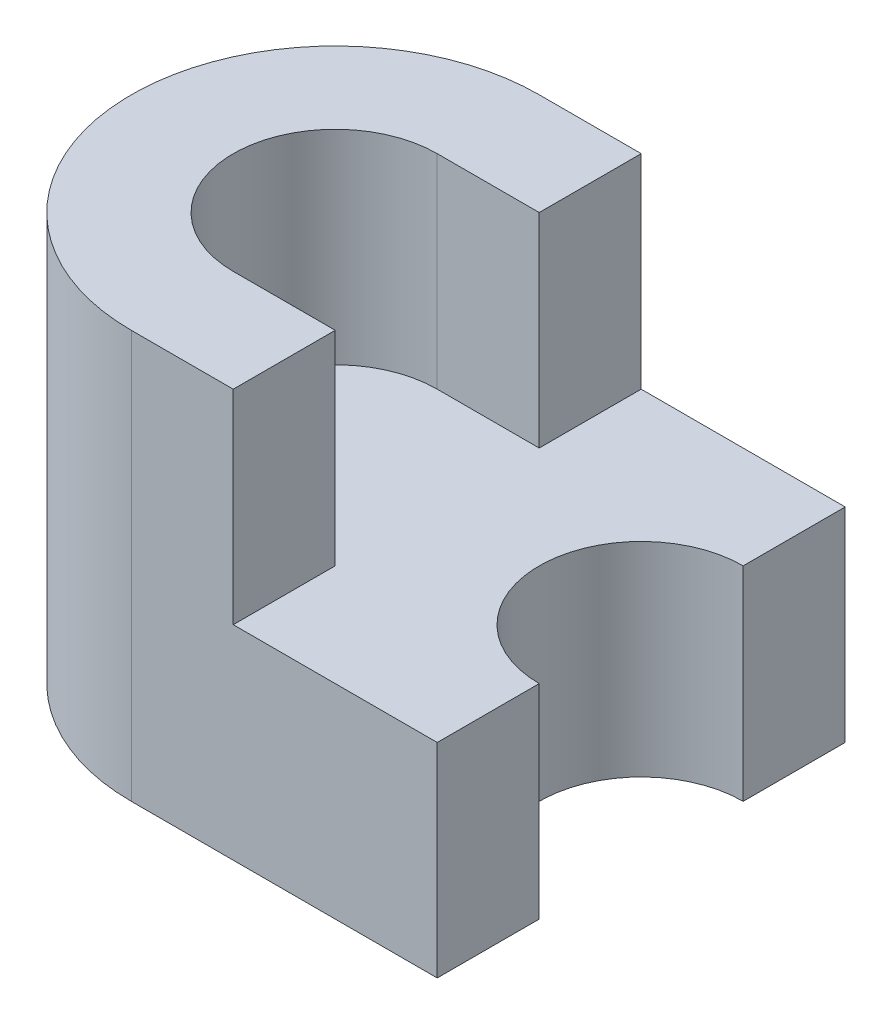
ISO-10303-21;
HEADER;
FILE_DESCRIPTION(('STEP AP214'),'2;1');
FILE_NAME('part.step','',(''),(''),'','','');
FILE_SCHEMA(('AUTOMOTIVE_DESIGN { 1 0 10303 214 1 1 1 1 }'));
ENDSEC;
DATA;
#1=APPLICATION_CONTEXT('core data for automotive mechanical design processes');
#2=APPLICATION_PROTOCOL_DEFINITION('international standard','automotive_design',2000,#1);
#3=PRODUCT_CONTEXT('',#1,'mechanical');
#4=PRODUCT('Part','Part','',(#3));
#5=PRODUCT_RELATED_PRODUCT_CATEGORY('part','',(#4));
#6=PRODUCT_DEFINITION_FORMATION('','',#4);
#7=PRODUCT_DEFINITION_CONTEXT('part definition',#1,'design');
#8=PRODUCT_DEFINITION('design','',#6,#7);
#9=PRODUCT_DEFINITION_SHAPE('','',#8);
#10=(LENGTH_UNIT() NAMED_UNIT(*) SI_UNIT(.MILLI.,.METRE.));
#11=(NAMED_UNIT(*) PLANE_ANGLE_UNIT() SI_UNIT($,.RADIAN.));
#12=(NAMED_UNIT(*) SI_UNIT($,.STERADIAN.) SOLID_ANGLE_UNIT());
#13=UNCERTAINTY_MEASURE_WITH_UNIT(LENGTH_MEASURE(1.E-05),#10,'distance_accuracy_value','');
#14=(GEOMETRIC_REPRESENTATION_CONTEXT(3) GLOBAL_UNCERTAINTY_ASSIGNED_CONTEXT((#13)) GLOBAL_UNIT_ASSIGNED_CONTEXT((#10,
#11,#12)) REPRESENTATION_CONTEXT('',''));
#15=CARTESIAN_POINT('',(0.,0.,0.));
#16=DIRECTION('',(0.,0.,1.));
#17=DIRECTION('',(1.,0.,0.));
#18=AXIS2_PLACEMENT_3D('',#15,#16,#17);
#19=CARTESIAN_POINT('',(0.,20.,0.));
#20=DIRECTION('',(0.,1.,0.));
#21=DIRECTION('',(0.,0.,1.));
#22=AXIS2_PLACEMENT_3D('',#19,#20,#21);
#23=PLANE('',#22);
#24=DIRECTION('',(1.,0.,0.));
#25=VECTOR('',#24,1.);
#26=CARTESIAN_POINT('',(0.,20.,10.));
#27=LINE('',#26,#25);
#28=CARTESIAN_POINT('',(0.,20.,10.));
#29=VERTEX_POINT('',#28);
#30=CARTESIAN_POINT('',(10.,20.,10.));
#31=VERTEX_POINT('',#30);
#32=EDGE_CURVE('E196',#29,#31,#27,.T.);
#33=ORIENTED_EDGE('',*,*,#32,.T.);
#34=DIRECTION('',(0.,0.,1.));
#35=VECTOR('',#34,1.);
#36=CARTESIAN_POINT('',(10.,20.,10.));
#37=LINE('',#36,#35);
#38=CARTESIAN_POINT('',(10.,20.,20.));
#39=VERTEX_POINT('',#38);
#40=EDGE_CURVE('E193',#31,#39,#37,.T.);
#41=ORIENTED_EDGE('',*,*,#40,.T.);
#42=DIRECTION('',(1.,0.,0.));
#43=VECTOR('',#42,1.);
#44=CARTESIAN_POINT('',(30.,20.,20.));
#45=LINE('',#44,#43);
#46=CARTESIAN_POINT('',(30.,20.,20.));
#47=VERTEX_POINT('',#46);
#48=EDGE_CURVE('E99',#39,#47,#45,.T.);
#49=ORIENTED_EDGE('',*,*,#48,.T.);
#50=DIRECTION('',(0.,0.,-1.));
#51=VECTOR('',#50,1.);
#52=CARTESIAN_POINT('',(30.,20.,10.));
#53=LINE('',#52,#51);
#54=CARTESIAN_POINT('',(30.,20.,10.));
#55=VERTEX_POINT('',#54);
#56=EDGE_CURVE('E218',#47,#55,#53,.T.);
#57=ORIENTED_EDGE('',*,*,#56,.T.);
#58=CARTESIAN_POINT('',(30.,20.,0.));
#59=DIRECTION('',(0.,-1.,0.));
#60=DIRECTION('',(0.,0.,1.));
#61=AXIS2_PLACEMENT_3D('',#58,#59,#60);
#62=CIRCLE('',#61,10.);
#63=CARTESIAN_POINT('',(30.,20.,-10.));
#64=VERTEX_POINT('',#63);
#65=EDGE_CURVE('E221',#55,#64,#62,.T.);
#66=ORIENTED_EDGE('',*,*,#65,.T.);
#67=DIRECTION('',(0.,0.,-1.));
#68=VECTOR('',#67,1.);
#69=CARTESIAN_POINT('',(30.,20.,-20.));
#70=LINE('',#69,#68);
#71=CARTESIAN_POINT('',(30.,20.,-20.));
#72=VERTEX_POINT('',#71);
#73=EDGE_CURVE('E64',#64,#72,#70,.T.);
#74=ORIENTED_EDGE('',*,*,#73,.T.);
#75=DIRECTION('',(-1.,0.,0.));
#76=VECTOR('',#75,1.);
#77=CARTESIAN_POINT('',(0.,20.,-20.));
#78=LINE('',#77,#76);
#79=CARTESIAN_POINT('',(10.,20.,-20.));
#80=VERTEX_POINT('',#79);
#81=EDGE_CURVE('E226',#72,#80,#78,.T.);
#82=ORIENTED_EDGE('',*,*,#81,.T.);
#83=DIRECTION('',(0.,0.,1.));
#84=VECTOR('',#83,1.);
#85=CARTESIAN_POINT('',(10.,20.,-20.));
#86=LINE('',#85,#84);
#87=CARTESIAN_POINT('',(10.,20.,-10.));
#88=VERTEX_POINT('',#87);
#89=EDGE_CURVE('E190',#80,#88,#86,.T.);
#90=ORIENTED_EDGE('',*,*,#89,.T.);
#91=DIRECTION('',(1.,0.,0.));
#92=VECTOR('',#91,1.);
#93=CARTESIAN_POINT('',(0.,20.,-10.));
#94=LINE('',#93,#92);
#95=CARTESIAN_POINT('',(0.,20.,-10.));
#96=VERTEX_POINT('',#95);
#97=EDGE_CURVE('E55',#96,#88,#94,.T.);
#98=ORIENTED_EDGE('',*,*,#97,.F.);
#99=CARTESIAN_POINT('',(0.,20.,0.));
#100=DIRECTION('',(0.,1.,0.));
#101=DIRECTION('',(0.,0.,1.));
#102=AXIS2_PLACEMENT_3D('',#99,#100,#101);
#103=CIRCLE('',#102,10.);
#104=EDGE_CURVE('E151',#96,#29,#103,.T.);
#105=ORIENTED_EDGE('',*,*,#104,.T.);
#106=EDGE_LOOP('',(#33,#41,#49,#57,#66,#74,#82,#90,#98,#105));
#107=FACE_BOUND('',#106,.T.);
#108=ADVANCED_FACE('F39',(#107),#23,.T.);
#109=CARTESIAN_POINT('',(0.,20.,0.));
#110=DIRECTION('',(0.,-1.,0.));
#111=DIRECTION('',(0.,0.,-1.));
#112=AXIS2_PLACEMENT_3D('',#109,#110,#111);
#113=CYLINDRICAL_SURFACE('',#112,20.);
#114=CARTESIAN_POINT('',(0.,0.,0.));
#115=DIRECTION('',(0.,1.,0.));
#116=DIRECTION('',(0.,0.,1.));
#117=AXIS2_PLACEMENT_3D('',#114,#115,#116);
#118=CIRCLE('',#117,20.);
#119=CARTESIAN_POINT('',(0.,0.,-20.));
#120=VERTEX_POINT('',#119);
#121=CARTESIAN_POINT('',(0.,0.,20.));
#122=VERTEX_POINT('',#121);
#123=EDGE_CURVE('E159',#120,#122,#118,.T.);
#124=ORIENTED_EDGE('',*,*,#123,.T.);
#125=DIRECTION('',(0.,-1.,0.));
#126=VECTOR('',#125,1.);
#127=CARTESIAN_POINT('',(0.,20.,20.));
#128=LINE('',#127,#126);
#129=CARTESIAN_POINT('',(0.,40.,20.));
#130=VERTEX_POINT('',#129);
#131=EDGE_CURVE('E11',#130,#122,#128,.T.);
#132=ORIENTED_EDGE('',*,*,#131,.F.);
#133=CARTESIAN_POINT('',(0.,40.,0.));
#134=DIRECTION('',(0.,1.,0.));
#135=DIRECTION('',(0.,0.,1.));
#136=AXIS2_PLACEMENT_3D('',#133,#134,#135);
#137=CIRCLE('',#136,20.);
#138=CARTESIAN_POINT('',(0.,40.,-20.));
#139=VERTEX_POINT('',#138);
#140=EDGE_CURVE('E167',#139,#130,#137,.T.);
#141=ORIENTED_EDGE('',*,*,#140,.F.);
#142=DIRECTION('',(0.,-1.,0.));
#143=VECTOR('',#142,1.);
#144=CARTESIAN_POINT('',(0.,20.,-20.));
#145=LINE('',#144,#143);
#146=EDGE_CURVE('E229',#139,#120,#145,.T.);
#147=ORIENTED_EDGE('',*,*,#146,.T.);
#148=EDGE_LOOP('',(#124,#132,#141,#147));
#149=FACE_BOUND('',#148,.T.);
#150=ADVANCED_FACE('F41',(#149),#113,.T.);
#151=CARTESIAN_POINT('',(30.,20.,20.));
#152=DIRECTION('',(0.,0.,-1.));
#153=DIRECTION('',(-1.,0.,0.));
#154=AXIS2_PLACEMENT_3D('',#151,#152,#153);
#155=PLANE('',#154);
#156=DIRECTION('',(1.,0.,0.));
#157=VECTOR('',#156,1.);
#158=CARTESIAN_POINT('',(30.,0.,20.));
#159=LINE('',#158,#157);
#160=CARTESIAN_POINT('',(30.,0.,20.));
#161=VERTEX_POINT('',#160);
#162=EDGE_CURVE('E233',#122,#161,#159,.T.);
#163=ORIENTED_EDGE('',*,*,#162,.T.);
#164=DIRECTION('',(0.,-1.,0.));
#165=VECTOR('',#164,1.);
#166=CARTESIAN_POINT('',(30.,20.,20.));
#167=LINE('',#166,#165);
#168=EDGE_CURVE('E48',#47,#161,#167,.T.);
#169=ORIENTED_EDGE('',*,*,#168,.F.);
#170=ORIENTED_EDGE('',*,*,#48,.F.);
#171=DIRECTION('',(0.,-1.,0.));
#172=VECTOR('',#171,1.);
#173=CARTESIAN_POINT('',(10.,40.,20.));
#174=LINE('',#173,#172);
#175=CARTESIAN_POINT('',(10.,40.,20.));
#176=VERTEX_POINT('',#175);
#177=EDGE_CURVE('E211',#176,#39,#174,.T.);
#178=ORIENTED_EDGE('',*,*,#177,.F.);
#179=DIRECTION('',(-1.,0.,0.));
#180=VECTOR('',#179,1.);
#181=CARTESIAN_POINT('',(10.,40.,20.));
#182=LINE('',#181,#180);
#183=EDGE_CURVE('E173',#176,#130,#182,.T.);
#184=ORIENTED_EDGE('',*,*,#183,.T.);
#185=ORIENTED_EDGE('',*,*,#131,.T.);
#186=EDGE_LOOP('',(#163,#169,#170,#178,#184,#185));
#187=FACE_BOUND('',#186,.T.);
#188=ADVANCED_FACE('F290',(#187),#155,.F.);
#189=CARTESIAN_POINT('',(30.,20.,10.));
#190=DIRECTION('',(-1.,0.,0.));
#191=DIRECTION('',(0.,0.,1.));
#192=AXIS2_PLACEMENT_3D('',#189,#190,#191);
#193=PLANE('',#192);
#194=DIRECTION('',(0.,0.,-1.));
#195=VECTOR('',#194,1.);
#196=CARTESIAN_POINT('',(30.,0.,10.));
#197=LINE('',#196,#195);
#198=CARTESIAN_POINT('',(30.,0.,10.));
#199=VERTEX_POINT('',#198);
#200=EDGE_CURVE('E236',#161,#199,#197,.T.);
#201=ORIENTED_EDGE('',*,*,#200,.T.);
#202=DIRECTION('',(0.,-1.,0.));
#203=VECTOR('',#202,1.);
#204=CARTESIAN_POINT('',(30.,20.,10.));
#205=LINE('',#204,#203);
#206=EDGE_CURVE('E256',#55,#199,#205,.T.);
#207=ORIENTED_EDGE('',*,*,#206,.F.);
#208=ORIENTED_EDGE('',*,*,#56,.F.);
#209=ORIENTED_EDGE('',*,*,#168,.T.);
#210=EDGE_LOOP('',(#201,#207,#208,#209));
#211=FACE_BOUND('',#210,.T.);
#212=ADVANCED_FACE('F264',(#211),#193,.F.);
#213=CARTESIAN_POINT('',(30.,20.,0.));
#214=DIRECTION('',(0.,-1.,0.));
#215=DIRECTION('',(0.,0.,-1.));
#216=AXIS2_PLACEMENT_3D('',#213,#214,#215);
#217=CYLINDRICAL_SURFACE('',#216,10.);
#218=CARTESIAN_POINT('',(30.,0.,0.));
#219=DIRECTION('',(0.,-1.,0.));
#220=DIRECTION('',(0.,0.,1.));
#221=AXIS2_PLACEMENT_3D('',#218,#219,#220);
#222=CIRCLE('',#221,10.);
#223=CARTESIAN_POINT('',(30.,0.,-10.));
#224=VERTEX_POINT('',#223);
#225=EDGE_CURVE('E239',#199,#224,#222,.T.);
#226=ORIENTED_EDGE('',*,*,#225,.T.);
#227=DIRECTION('',(0.,-1.,0.));
#228=VECTOR('',#227,1.);
#229=CARTESIAN_POINT('',(30.,20.,-10.));
#230=LINE('',#229,#228);
#231=EDGE_CURVE('E252',#64,#224,#230,.T.);
#232=ORIENTED_EDGE('',*,*,#231,.F.);
#233=ORIENTED_EDGE('',*,*,#65,.F.);
#234=ORIENTED_EDGE('',*,*,#206,.T.);
#235=EDGE_LOOP('',(#226,#232,#233,#234));
#236=FACE_BOUND('',#235,.T.);
#237=ADVANCED_FACE('F274',(#236),#217,.F.);
#238=CARTESIAN_POINT('',(30.,20.,-20.));
#239=DIRECTION('',(-1.,0.,0.));
#240=DIRECTION('',(0.,0.,1.));
#241=AXIS2_PLACEMENT_3D('',#238,#239,#240);
#242=PLANE('',#241);
#243=DIRECTION('',(0.,0.,-1.));
#244=VECTOR('',#243,1.);
#245=CARTESIAN_POINT('',(30.,0.,-20.));
#246=LINE('',#245,#244);
#247=CARTESIAN_POINT('',(30.,0.,-20.));
#248=VERTEX_POINT('',#247);
#249=EDGE_CURVE('E242',#224,#248,#246,.T.);
#250=ORIENTED_EDGE('',*,*,#249,.T.);
#251=DIRECTION('',(0.,-1.,0.));
#252=VECTOR('',#251,1.);
#253=CARTESIAN_POINT('',(30.,20.,-20.));
#254=LINE('',#253,#252);
#255=EDGE_CURVE('E249',#72,#248,#254,.T.);
#256=ORIENTED_EDGE('',*,*,#255,.F.);
#257=ORIENTED_EDGE('',*,*,#73,.F.);
#258=ORIENTED_EDGE('',*,*,#231,.T.);
#259=EDGE_LOOP('',(#250,#256,#257,#258));
#260=FACE_BOUND('',#259,.T.);
#261=ADVANCED_FACE('F277',(#260),#242,.F.);
#262=CARTESIAN_POINT('',(0.,20.,-20.));
#263=DIRECTION('',(0.,0.,1.));
#264=DIRECTION('',(1.,0.,0.));
#265=AXIS2_PLACEMENT_3D('',#262,#263,#264);
#266=PLANE('',#265);
#267=DIRECTION('',(-1.,0.,0.));
#268=VECTOR('',#267,1.);
#269=CARTESIAN_POINT('',(0.,0.,-20.));
#270=LINE('',#269,#268);
#271=EDGE_CURVE('E92',#248,#120,#270,.T.);
#272=ORIENTED_EDGE('',*,*,#271,.T.);
#273=ORIENTED_EDGE('',*,*,#146,.F.);
#274=DIRECTION('',(1.,0.,0.));
#275=VECTOR('',#274,1.);
#276=CARTESIAN_POINT('',(0.,40.,-20.));
#277=LINE('',#276,#275);
#278=CARTESIAN_POINT('',(10.,40.,-20.));
#279=VERTEX_POINT('',#278);
#280=EDGE_CURVE('E164',#139,#279,#277,.T.);
#281=ORIENTED_EDGE('',*,*,#280,.T.);
#282=DIRECTION('',(0.,-1.,0.));
#283=VECTOR('',#282,1.);
#284=CARTESIAN_POINT('',(10.,40.,-20.));
#285=LINE('',#284,#283);
#286=EDGE_CURVE('E160',#279,#80,#285,.T.);
#287=ORIENTED_EDGE('',*,*,#286,.T.);
#288=ORIENTED_EDGE('',*,*,#81,.F.);
#289=ORIENTED_EDGE('',*,*,#255,.T.);
#290=EDGE_LOOP('',(#272,#273,#281,#287,#288,#289));
#291=FACE_BOUND('',#290,.T.);
#292=ADVANCED_FACE('F279',(#291),#266,.F.);
#293=CARTESIAN_POINT('',(0.,0.,0.));
#294=DIRECTION('',(0.,1.,0.));
#295=DIRECTION('',(0.,0.,1.));
#296=AXIS2_PLACEMENT_3D('',#293,#294,#295);
#297=PLANE('',#296);
#298=ORIENTED_EDGE('',*,*,#123,.F.);
#299=ORIENTED_EDGE('',*,*,#271,.F.);
#300=ORIENTED_EDGE('',*,*,#249,.F.);
#301=ORIENTED_EDGE('',*,*,#225,.F.);
#302=ORIENTED_EDGE('',*,*,#200,.F.);
#303=ORIENTED_EDGE('',*,*,#162,.F.);
#304=EDGE_LOOP('',(#298,#299,#300,#301,#302,#303));
#305=FACE_BOUND('',#304,.T.);
#306=ADVANCED_FACE('F270',(#305),#297,.F.);
#307=CARTESIAN_POINT('',(0.,40.,-10.));
#308=DIRECTION('',(0.,0.,-1.));
#309=DIRECTION('',(-1.,0.,0.));
#310=AXIS2_PLACEMENT_3D('',#307,#308,#309);
#311=PLANE('',#310);
#312=ORIENTED_EDGE('',*,*,#97,.T.);
#313=DIRECTION('',(0.,-1.,0.));
#314=VECTOR('',#313,1.);
#315=CARTESIAN_POINT('',(10.,40.,-10.));
#316=LINE('',#315,#314);
#317=CARTESIAN_POINT('',(10.,40.,-10.));
#318=VERTEX_POINT('',#317);
#319=EDGE_CURVE('E153',#318,#88,#316,.T.);
#320=ORIENTED_EDGE('',*,*,#319,.F.);
#321=DIRECTION('',(1.,0.,0.));
#322=VECTOR('',#321,1.);
#323=CARTESIAN_POINT('',(0.,40.,-10.));
#324=LINE('',#323,#322);
#325=CARTESIAN_POINT('',(0.,40.,-10.));
#326=VERTEX_POINT('',#325);
#327=EDGE_CURVE('E141',#326,#318,#324,.T.);
#328=ORIENTED_EDGE('',*,*,#327,.F.);
#329=DIRECTION('',(0.,-1.,0.));
#330=VECTOR('',#329,1.);
#331=CARTESIAN_POINT('',(0.,40.,-10.));
#332=LINE('',#331,#330);
#333=EDGE_CURVE('E187',#326,#96,#332,.T.);
#334=ORIENTED_EDGE('',*,*,#333,.T.);
#335=EDGE_LOOP('',(#312,#320,#328,#334));
#336=FACE_BOUND('',#335,.T.);
#337=ADVANCED_FACE('F154',(#336),#311,.F.);
#338=CARTESIAN_POINT('',(10.,40.,-20.));
#339=DIRECTION('',(1.,0.,0.));
#340=DIRECTION('',(0.,0.,-1.));
#341=AXIS2_PLACEMENT_3D('',#338,#339,#340);
#342=PLANE('',#341);
#343=ORIENTED_EDGE('',*,*,#89,.F.);
#344=ORIENTED_EDGE('',*,*,#286,.F.);
#345=DIRECTION('',(0.,0.,1.));
#346=VECTOR('',#345,1.);
#347=CARTESIAN_POINT('',(10.,40.,-20.));
#348=LINE('',#347,#346);
#349=EDGE_CURVE('E145',#279,#318,#348,.T.);
#350=ORIENTED_EDGE('',*,*,#349,.T.);
#351=ORIENTED_EDGE('',*,*,#319,.T.);
#352=EDGE_LOOP('',(#343,#344,#350,#351));
#353=FACE_BOUND('',#352,.T.);
#354=ADVANCED_FACE('F162',(#353),#342,.T.);
#355=CARTESIAN_POINT('',(10.,40.,10.));
#356=DIRECTION('',(1.,0.,0.));
#357=DIRECTION('',(0.,0.,-1.));
#358=AXIS2_PLACEMENT_3D('',#355,#356,#357);
#359=PLANE('',#358);
#360=ORIENTED_EDGE('',*,*,#40,.F.);
#361=DIRECTION('',(0.,-1.,0.));
#362=VECTOR('',#361,1.);
#363=CARTESIAN_POINT('',(10.,40.,10.));
#364=LINE('',#363,#362);
#365=CARTESIAN_POINT('',(10.,40.,10.));
#366=VERTEX_POINT('',#365);
#367=EDGE_CURVE('E208',#366,#31,#364,.T.);
#368=ORIENTED_EDGE('',*,*,#367,.F.);
#369=DIRECTION('',(0.,0.,1.));
#370=VECTOR('',#369,1.);
#371=CARTESIAN_POINT('',(10.,40.,10.));
#372=LINE('',#371,#370);
#373=EDGE_CURVE('E177',#366,#176,#372,.T.);
#374=ORIENTED_EDGE('',*,*,#373,.T.);
#375=ORIENTED_EDGE('',*,*,#177,.T.);
#376=EDGE_LOOP('',(#360,#368,#374,#375));
#377=FACE_BOUND('',#376,.T.);
#378=ADVANCED_FACE('F289',(#377),#359,.T.);
#379=CARTESIAN_POINT('',(0.,40.,10.));
#380=DIRECTION('',(0.,0.,-1.));
#381=DIRECTION('',(-1.,0.,0.));
#382=AXIS2_PLACEMENT_3D('',#379,#380,#381);
#383=PLANE('',#382);
#384=ORIENTED_EDGE('',*,*,#32,.F.);
#385=DIRECTION('',(0.,-1.,0.));
#386=VECTOR('',#385,1.);
#387=CARTESIAN_POINT('',(0.,40.,10.));
#388=LINE('',#387,#386);
#389=CARTESIAN_POINT('',(0.,40.,10.));
#390=VERTEX_POINT('',#389);
#391=EDGE_CURVE('E205',#390,#29,#388,.T.);
#392=ORIENTED_EDGE('',*,*,#391,.F.);
#393=DIRECTION('',(1.,0.,0.));
#394=VECTOR('',#393,1.);
#395=CARTESIAN_POINT('',(0.,40.,10.));
#396=LINE('',#395,#394);
#397=EDGE_CURVE('E181',#390,#366,#396,.T.);
#398=ORIENTED_EDGE('',*,*,#397,.T.);
#399=ORIENTED_EDGE('',*,*,#367,.T.);
#400=EDGE_LOOP('',(#384,#392,#398,#399));
#401=FACE_BOUND('',#400,.T.);
#402=ADVANCED_FACE('F285',(#401),#383,.T.);
#403=CARTESIAN_POINT('',(0.,40.,0.));
#404=DIRECTION('',(0.,-1.,0.));
#405=DIRECTION('',(0.,0.,-1.));
#406=AXIS2_PLACEMENT_3D('',#403,#404,#405);
#407=CYLINDRICAL_SURFACE('',#406,10.);
#408=ORIENTED_EDGE('',*,*,#104,.F.);
#409=ORIENTED_EDGE('',*,*,#333,.F.);
#410=CARTESIAN_POINT('',(0.,40.,0.));
#411=DIRECTION('',(0.,1.,0.));
#412=DIRECTION('',(0.,0.,1.));
#413=AXIS2_PLACEMENT_3D('',#410,#411,#412);
#414=CIRCLE('',#413,10.);
#415=EDGE_CURVE('E149',#326,#390,#414,.T.);
#416=ORIENTED_EDGE('',*,*,#415,.T.);
#417=ORIENTED_EDGE('',*,*,#391,.T.);
#418=EDGE_LOOP('',(#408,#409,#416,#417));
#419=FACE_BOUND('',#418,.T.);
#420=ADVANCED_FACE('F283',(#419),#407,.F.);
#421=CARTESIAN_POINT('',(0.,40.,0.));
#422=DIRECTION('',(0.,1.,0.));
#423=DIRECTION('',(0.,0.,1.));
#424=AXIS2_PLACEMENT_3D('',#421,#422,#423);
#425=PLANE('',#424);
#426=ORIENTED_EDGE('',*,*,#327,.T.);
#427=ORIENTED_EDGE('',*,*,#349,.F.);
#428=ORIENTED_EDGE('',*,*,#280,.F.);
#429=ORIENTED_EDGE('',*,*,#140,.T.);
#430=ORIENTED_EDGE('',*,*,#183,.F.);
#431=ORIENTED_EDGE('',*,*,#373,.F.);
#432=ORIENTED_EDGE('',*,*,#397,.F.);
#433=ORIENTED_EDGE('',*,*,#415,.F.);
#434=EDGE_LOOP('',(#426,#427,#428,#429,#430,#431,#432,#433));
#435=FACE_BOUND('',#434,.T.);
#436=ADVANCED_FACE('F142',(#435),#425,.T.);
#437=CLOSED_SHELL('',(#108,#150,#188,#212,#237,#261,#292,#306,#337,#354,#378,#402,#420,#436));
#438=MANIFOLD_SOLID_BREP('B2',#437);
#439=ADVANCED_BREP_SHAPE_REPRESENTATION('',(#18,#438),#14);
#440=SHAPE_DEFINITION_REPRESENTATION(#9,#439);
ENDSEC;
END-ISO-10303-21;
